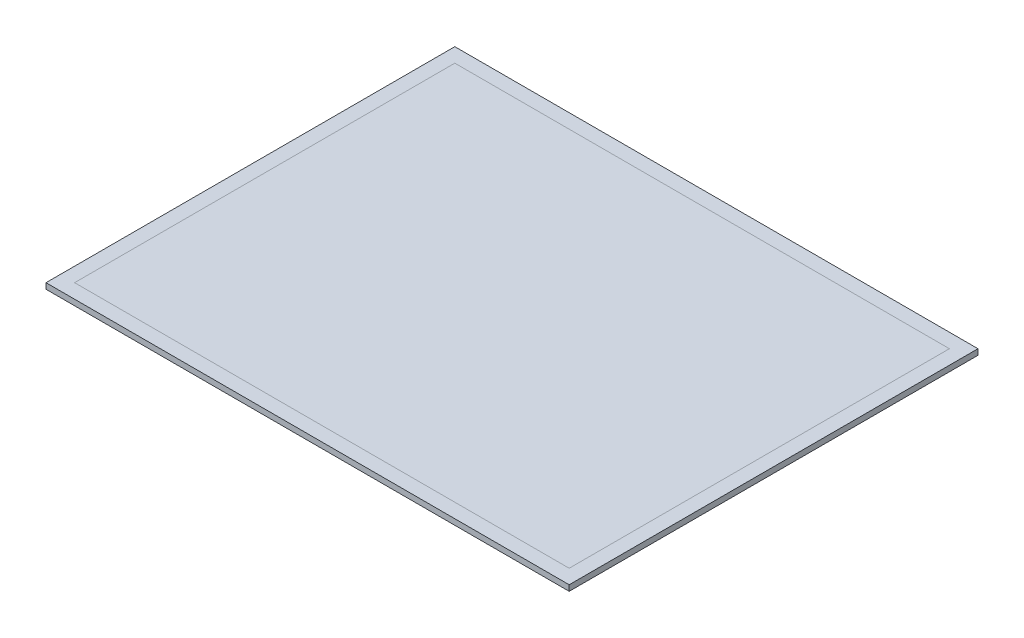
ISO-10303-21;
HEADER;
FILE_DESCRIPTION(('STEP AP214'),'2;1');
FILE_NAME('part.step','',(''),(''),'','','');
FILE_SCHEMA(('AUTOMOTIVE_DESIGN { 1 0 10303 214 1 1 1 1 }'));
ENDSEC;
DATA;
#1=APPLICATION_CONTEXT('core data for automotive mechanical design processes');
#2=APPLICATION_PROTOCOL_DEFINITION('international standard','automotive_design',2000,#1);
#3=PRODUCT_CONTEXT('',#1,'mechanical');
#4=PRODUCT('Part','Part','',(#3));
#5=PRODUCT_RELATED_PRODUCT_CATEGORY('part','',(#4));
#6=PRODUCT_DEFINITION_FORMATION('','',#4);
#7=PRODUCT_DEFINITION_CONTEXT('part definition',#1,'design');
#8=PRODUCT_DEFINITION('design','',#6,#7);
#9=PRODUCT_DEFINITION_SHAPE('','',#8);
#10=(LENGTH_UNIT() NAMED_UNIT(*) SI_UNIT(.MILLI.,.METRE.));
#11=(NAMED_UNIT(*) PLANE_ANGLE_UNIT() SI_UNIT($,.RADIAN.));
#12=(NAMED_UNIT(*) SI_UNIT($,.STERADIAN.) SOLID_ANGLE_UNIT());
#13=UNCERTAINTY_MEASURE_WITH_UNIT(LENGTH_MEASURE(1.E-05),#10,'distance_accuracy_value','');
#14=(GEOMETRIC_REPRESENTATION_CONTEXT(3) GLOBAL_UNCERTAINTY_ASSIGNED_CONTEXT((#13)) GLOBAL_UNIT_ASSIGNED_CONTEXT((#10,
#11,#12)) REPRESENTATION_CONTEXT('',''));
#15=CARTESIAN_POINT('',(0.,0.,0.));
#16=DIRECTION('',(0.,0.,1.));
#17=DIRECTION('',(1.,0.,0.));
#18=AXIS2_PLACEMENT_3D('',#15,#16,#17);
#19=CARTESIAN_POINT('',(-86.5,2.,0.));
#20=DIRECTION('',(-1.,0.,0.));
#21=DIRECTION('',(0.,0.,1.));
#22=AXIS2_PLACEMENT_3D('',#19,#20,#21);
#23=PLANE('',#22);
#24=DIRECTION('',(0.,0.,-1.));
#25=VECTOR('',#24,1.);
#26=CARTESIAN_POINT('',(-86.5,0.,0.));
#27=LINE('',#26,#25);
#28=CARTESIAN_POINT('',(-86.5,0.,66.5));
#29=VERTEX_POINT('',#28);
#30=CARTESIAN_POINT('',(-86.5,0.,-66.5));
#31=VERTEX_POINT('',#30);
#32=EDGE_CURVE('E110',#29,#31,#27,.T.);
#33=ORIENTED_EDGE('',*,*,#32,.F.);
#34=DIRECTION('',(0.,-1.,0.));
#35=VECTOR('',#34,1.);
#36=CARTESIAN_POINT('',(-86.5,2.,66.5));
#37=LINE('',#36,#35);
#38=CARTESIAN_POINT('',(-86.5,2.,66.5));
#39=VERTEX_POINT('',#38);
#40=EDGE_CURVE('E12',#39,#29,#37,.T.);
#41=ORIENTED_EDGE('',*,*,#40,.F.);
#42=DIRECTION('',(0.,0.,-1.));
#43=VECTOR('',#42,1.);
#44=CARTESIAN_POINT('',(-86.5,2.,0.));
#45=LINE('',#44,#43);
#46=CARTESIAN_POINT('',(-86.5,2.,-66.5));
#47=VERTEX_POINT('',#46);
#48=EDGE_CURVE('E95',#39,#47,#45,.T.);
#49=ORIENTED_EDGE('',*,*,#48,.T.);
#50=DIRECTION('',(0.,-1.,0.));
#51=VECTOR('',#50,1.);
#52=CARTESIAN_POINT('',(-86.5,2.,-66.5));
#53=LINE('',#52,#51);
#54=EDGE_CURVE('E63',#47,#31,#53,.T.);
#55=ORIENTED_EDGE('',*,*,#54,.T.);
#56=EDGE_LOOP('',(#33,#41,#49,#55));
#57=FACE_BOUND('',#56,.T.);
#58=ADVANCED_FACE('F47',(#57),#23,.T.);
#59=CARTESIAN_POINT('',(0.,2.,66.5));
#60=DIRECTION('',(0.,0.,-1.));
#61=DIRECTION('',(-1.,0.,0.));
#62=AXIS2_PLACEMENT_3D('',#59,#60,#61);
#63=PLANE('',#62);
#64=DIRECTION('',(1.,0.,0.));
#65=VECTOR('',#64,1.);
#66=CARTESIAN_POINT('',(0.,0.,66.5));
#67=LINE('',#66,#65);
#68=CARTESIAN_POINT('',(86.5,0.,66.5));
#69=VERTEX_POINT('',#68);
#70=EDGE_CURVE('E101',#29,#69,#67,.T.);
#71=ORIENTED_EDGE('',*,*,#70,.T.);
#72=DIRECTION('',(0.,-1.,0.));
#73=VECTOR('',#72,1.);
#74=CARTESIAN_POINT('',(86.5,2.,66.5));
#75=LINE('',#74,#73);
#76=CARTESIAN_POINT('',(86.5,2.,66.5));
#77=VERTEX_POINT('',#76);
#78=EDGE_CURVE('E55',#77,#69,#75,.T.);
#79=ORIENTED_EDGE('',*,*,#78,.F.);
#80=DIRECTION('',(1.,0.,0.));
#81=VECTOR('',#80,1.);
#82=CARTESIAN_POINT('',(0.,2.,66.5));
#83=LINE('',#82,#81);
#84=EDGE_CURVE('E89',#39,#77,#83,.T.);
#85=ORIENTED_EDGE('',*,*,#84,.F.);
#86=ORIENTED_EDGE('',*,*,#40,.T.);
#87=EDGE_LOOP('',(#71,#79,#85,#86));
#88=FACE_BOUND('',#87,.T.);
#89=ADVANCED_FACE('F99',(#88),#63,.F.);
#90=CARTESIAN_POINT('',(86.5,2.,0.));
#91=DIRECTION('',(-1.,0.,0.));
#92=DIRECTION('',(0.,0.,1.));
#93=AXIS2_PLACEMENT_3D('',#90,#91,#92);
#94=PLANE('',#93);
#95=DIRECTION('',(0.,0.,-1.));
#96=VECTOR('',#95,1.);
#97=CARTESIAN_POINT('',(86.5,0.,0.));
#98=LINE('',#97,#96);
#99=CARTESIAN_POINT('',(86.5,0.,-66.5));
#100=VERTEX_POINT('',#99);
#101=EDGE_CURVE('E113',#69,#100,#98,.T.);
#102=ORIENTED_EDGE('',*,*,#101,.T.);
#103=DIRECTION('',(0.,-1.,0.));
#104=VECTOR('',#103,1.);
#105=CARTESIAN_POINT('',(86.5,2.,-66.5));
#106=LINE('',#105,#104);
#107=CARTESIAN_POINT('',(86.5,2.,-66.5));
#108=VERTEX_POINT('',#107);
#109=EDGE_CURVE('E77',#108,#100,#106,.T.);
#110=ORIENTED_EDGE('',*,*,#109,.F.);
#111=DIRECTION('',(0.,0.,-1.));
#112=VECTOR('',#111,1.);
#113=CARTESIAN_POINT('',(86.5,2.,0.));
#114=LINE('',#113,#112);
#115=EDGE_CURVE('E94',#77,#108,#114,.T.);
#116=ORIENTED_EDGE('',*,*,#115,.F.);
#117=ORIENTED_EDGE('',*,*,#78,.T.);
#118=EDGE_LOOP('',(#102,#110,#116,#117));
#119=FACE_BOUND('',#118,.T.);
#120=ADVANCED_FACE('F104',(#119),#94,.F.);
#121=CARTESIAN_POINT('',(0.,2.,-66.5));
#122=DIRECTION('',(0.,0.,-1.));
#123=DIRECTION('',(-1.,0.,0.));
#124=AXIS2_PLACEMENT_3D('',#121,#122,#123);
#125=PLANE('',#124);
#126=DIRECTION('',(1.,0.,0.));
#127=VECTOR('',#126,1.);
#128=CARTESIAN_POINT('',(0.,0.,-66.5));
#129=LINE('',#128,#127);
#130=EDGE_CURVE('E115',#31,#100,#129,.T.);
#131=ORIENTED_EDGE('',*,*,#130,.F.);
#132=ORIENTED_EDGE('',*,*,#54,.F.);
#133=DIRECTION('',(1.,0.,0.));
#134=VECTOR('',#133,1.);
#135=CARTESIAN_POINT('',(0.,2.,-66.5));
#136=LINE('',#135,#134);
#137=EDGE_CURVE('E105',#47,#108,#136,.T.);
#138=ORIENTED_EDGE('',*,*,#137,.T.);
#139=ORIENTED_EDGE('',*,*,#109,.T.);
#140=EDGE_LOOP('',(#131,#132,#138,#139));
#141=FACE_BOUND('',#140,.T.);
#142=ADVANCED_FACE('F120',(#141),#125,.T.);
#143=CARTESIAN_POINT('',(0.,2.,0.));
#144=DIRECTION('',(0.,1.,0.));
#145=DIRECTION('',(0.,0.,1.));
#146=AXIS2_PLACEMENT_3D('',#143,#144,#145);
#147=PLANE('',#146);
#148=ORIENTED_EDGE('',*,*,#48,.F.);
#149=ORIENTED_EDGE('',*,*,#84,.T.);
#150=ORIENTED_EDGE('',*,*,#115,.T.);
#151=ORIENTED_EDGE('',*,*,#137,.F.);
#152=EDGE_LOOP('',(#148,#149,#150,#151));
#153=FACE_BOUND('',#152,.T.);
#154=ADVANCED_FACE('F91',(#153),#147,.T.);
#155=CARTESIAN_POINT('',(0.,0.,0.));
#156=DIRECTION('',(0.,1.,0.));
#157=DIRECTION('',(0.,0.,1.));
#158=AXIS2_PLACEMENT_3D('',#155,#156,#157);
#159=PLANE('',#158);
#160=ORIENTED_EDGE('',*,*,#32,.T.);
#161=ORIENTED_EDGE('',*,*,#130,.T.);
#162=ORIENTED_EDGE('',*,*,#101,.F.);
#163=ORIENTED_EDGE('',*,*,#70,.F.);
#164=EDGE_LOOP('',(#160,#161,#162,#163));
#165=FACE_BOUND('',#164,.T.);
#166=ADVANCED_FACE('F127',(#165),#159,.F.);
#167=CLOSED_SHELL('',(#58,#89,#120,#142,#154,#166));
#168=MANIFOLD_SOLID_BREP('B2',#167);
#169=CARTESIAN_POINT('',(0.,2.,0.));
#170=DIRECTION('',(0.,-1.,0.));
#171=DIRECTION('',(0.,0.,-1.));
#172=AXIS2_PLACEMENT_3D('',#169,#170,#171);
#173=PLANE('',#172);
#174=DIRECTION('',(0.,0.,-1.));
#175=VECTOR('',#174,1.);
#176=CARTESIAN_POINT('',(91.5,2.,71.5));
#177=LINE('',#176,#175);
#178=CARTESIAN_POINT('',(91.5,2.,71.5));
#179=VERTEX_POINT('',#178);
#180=CARTESIAN_POINT('',(91.5,2.,-71.5));
#181=VERTEX_POINT('',#180);
#182=EDGE_CURVE('E284',#179,#181,#177,.T.);
#183=ORIENTED_EDGE('',*,*,#182,.T.);
#184=DIRECTION('',(-1.,0.,0.));
#185=VECTOR('',#184,1.);
#186=CARTESIAN_POINT('',(-91.5,2.,-71.5));
#187=LINE('',#186,#185);
#188=CARTESIAN_POINT('',(-91.5,2.,-71.5));
#189=VERTEX_POINT('',#188);
#190=EDGE_CURVE('E287',#181,#189,#187,.T.);
#191=ORIENTED_EDGE('',*,*,#190,.T.);
#192=DIRECTION('',(0.,0.,1.));
#193=VECTOR('',#192,1.);
#194=CARTESIAN_POINT('',(-91.5,2.,71.5));
#195=LINE('',#194,#193);
#196=CARTESIAN_POINT('',(-91.5,2.,71.5));
#197=VERTEX_POINT('',#196);
#198=EDGE_CURVE('E290',#189,#197,#195,.T.);
#199=ORIENTED_EDGE('',*,*,#198,.T.);
#200=DIRECTION('',(1.,0.,0.));
#201=VECTOR('',#200,1.);
#202=CARTESIAN_POINT('',(-91.5,2.,71.5));
#203=LINE('',#202,#201);
#204=EDGE_CURVE('E292',#197,#179,#203,.T.);
#205=ORIENTED_EDGE('',*,*,#204,.T.);
#206=EDGE_LOOP('',(#183,#191,#199,#205));
#207=FACE_BOUND('',#206,.T.);
#208=DIRECTION('',(1.,0.,0.));
#209=VECTOR('',#208,1.);
#210=CARTESIAN_POINT('',(-86.5,2.,66.5));
#211=LINE('',#210,#209);
#212=CARTESIAN_POINT('',(-86.5,2.,66.5));
#213=VERTEX_POINT('',#212);
#214=CARTESIAN_POINT('',(86.5,2.,66.5));
#215=VERTEX_POINT('',#214);
#216=EDGE_CURVE('E248',#213,#215,#211,.T.);
#217=ORIENTED_EDGE('',*,*,#216,.F.);
#218=DIRECTION('',(0.,0.,1.));
#219=VECTOR('',#218,1.);
#220=CARTESIAN_POINT('',(-86.5,2.,66.5));
#221=LINE('',#220,#219);
#222=CARTESIAN_POINT('',(-86.5,2.,-66.5));
#223=VERTEX_POINT('',#222);
#224=EDGE_CURVE('E270',#223,#213,#221,.T.);
#225=ORIENTED_EDGE('',*,*,#224,.F.);
#226=DIRECTION('',(-1.,0.,0.));
#227=VECTOR('',#226,1.);
#228=CARTESIAN_POINT('',(-86.5,2.,-66.5));
#229=LINE('',#228,#227);
#230=CARTESIAN_POINT('',(86.5,2.,-66.5));
#231=VERTEX_POINT('',#230);
#232=EDGE_CURVE('E268',#231,#223,#229,.T.);
#233=ORIENTED_EDGE('',*,*,#232,.F.);
#234=DIRECTION('',(0.,0.,-1.));
#235=VECTOR('',#234,1.);
#236=CARTESIAN_POINT('',(86.5,2.,66.5));
#237=LINE('',#236,#235);
#238=EDGE_CURVE('E256',#215,#231,#237,.T.);
#239=ORIENTED_EDGE('',*,*,#238,.F.);
#240=EDGE_LOOP('',(#217,#225,#233,#239));
#241=FACE_BOUND('',#240,.T.);
#242=ADVANCED_FACE('F183',(#207,#241),#173,.F.);
#243=CARTESIAN_POINT('',(0.,0.,0.));
#244=DIRECTION('',(0.,-1.,0.));
#245=DIRECTION('',(0.,0.,-1.));
#246=AXIS2_PLACEMENT_3D('',#243,#244,#245);
#247=PLANE('',#246);
#248=DIRECTION('',(0.,0.,-1.));
#249=VECTOR('',#248,1.);
#250=CARTESIAN_POINT('',(91.5,0.,71.5));
#251=LINE('',#250,#249);
#252=CARTESIAN_POINT('',(91.5,0.,71.5));
#253=VERTEX_POINT('',#252);
#254=CARTESIAN_POINT('',(91.5,0.,-71.5));
#255=VERTEX_POINT('',#254);
#256=EDGE_CURVE('E264',#253,#255,#251,.T.);
#257=ORIENTED_EDGE('',*,*,#256,.F.);
#258=DIRECTION('',(1.,0.,0.));
#259=VECTOR('',#258,1.);
#260=CARTESIAN_POINT('',(-91.5,0.,71.5));
#261=LINE('',#260,#259);
#262=CARTESIAN_POINT('',(-91.5,0.,71.5));
#263=VERTEX_POINT('',#262);
#264=EDGE_CURVE('E288',#263,#253,#261,.T.);
#265=ORIENTED_EDGE('',*,*,#264,.F.);
#266=DIRECTION('',(0.,0.,1.));
#267=VECTOR('',#266,1.);
#268=CARTESIAN_POINT('',(-91.5,0.,71.5));
#269=LINE('',#268,#267);
#270=CARTESIAN_POINT('',(-91.5,0.,-71.5));
#271=VERTEX_POINT('',#270);
#272=EDGE_CURVE('E299',#271,#263,#269,.T.);
#273=ORIENTED_EDGE('',*,*,#272,.F.);
#274=DIRECTION('',(-1.,0.,0.));
#275=VECTOR('',#274,1.);
#276=CARTESIAN_POINT('',(-91.5,0.,-71.5));
#277=LINE('',#276,#275);
#278=EDGE_CURVE('E297',#255,#271,#277,.T.);
#279=ORIENTED_EDGE('',*,*,#278,.F.);
#280=EDGE_LOOP('',(#257,#265,#273,#279));
#281=FACE_BOUND('',#280,.T.);
#282=DIRECTION('',(0.,0.,1.));
#283=VECTOR('',#282,1.);
#284=CARTESIAN_POINT('',(-86.5,0.,66.5));
#285=LINE('',#284,#283);
#286=CARTESIAN_POINT('',(-86.5,0.,-66.5));
#287=VERTEX_POINT('',#286);
#288=CARTESIAN_POINT('',(-86.5,0.,66.5));
#289=VERTEX_POINT('',#288);
#290=EDGE_CURVE('E257',#287,#289,#285,.T.);
#291=ORIENTED_EDGE('',*,*,#290,.T.);
#292=DIRECTION('',(1.,0.,0.));
#293=VECTOR('',#292,1.);
#294=CARTESIAN_POINT('',(-86.5,0.,66.5));
#295=LINE('',#294,#293);
#296=CARTESIAN_POINT('',(86.5,0.,66.5));
#297=VERTEX_POINT('',#296);
#298=EDGE_CURVE('E206',#289,#297,#295,.T.);
#299=ORIENTED_EDGE('',*,*,#298,.T.);
#300=DIRECTION('',(0.,0.,-1.));
#301=VECTOR('',#300,1.);
#302=CARTESIAN_POINT('',(86.5,0.,66.5));
#303=LINE('',#302,#301);
#304=CARTESIAN_POINT('',(86.5,0.,-66.5));
#305=VERTEX_POINT('',#304);
#306=EDGE_CURVE('E263',#297,#305,#303,.T.);
#307=ORIENTED_EDGE('',*,*,#306,.T.);
#308=DIRECTION('',(-1.,0.,0.));
#309=VECTOR('',#308,1.);
#310=CARTESIAN_POINT('',(-86.5,0.,-66.5));
#311=LINE('',#310,#309);
#312=EDGE_CURVE('E276',#305,#287,#311,.T.);
#313=ORIENTED_EDGE('',*,*,#312,.T.);
#314=EDGE_LOOP('',(#291,#299,#307,#313));
#315=FACE_BOUND('',#314,.T.);
#316=ADVANCED_FACE('F317',(#281,#315),#247,.T.);
#317=CARTESIAN_POINT('',(91.5,2.,71.5));
#318=DIRECTION('',(-1.,0.,0.));
#319=DIRECTION('',(0.,0.,1.));
#320=AXIS2_PLACEMENT_3D('',#317,#318,#319);
#321=PLANE('',#320);
#322=ORIENTED_EDGE('',*,*,#256,.T.);
#323=DIRECTION('',(0.,-1.,0.));
#324=VECTOR('',#323,1.);
#325=CARTESIAN_POINT('',(91.5,2.,-71.5));
#326=LINE('',#325,#324);
#327=EDGE_CURVE('E45',#181,#255,#326,.T.);
#328=ORIENTED_EDGE('',*,*,#327,.F.);
#329=ORIENTED_EDGE('',*,*,#182,.F.);
#330=DIRECTION('',(0.,-1.,0.));
#331=VECTOR('',#330,1.);
#332=CARTESIAN_POINT('',(91.5,2.,71.5));
#333=LINE('',#332,#331);
#334=EDGE_CURVE('E294',#179,#253,#333,.T.);
#335=ORIENTED_EDGE('',*,*,#334,.T.);
#336=EDGE_LOOP('',(#322,#328,#329,#335));
#337=FACE_BOUND('',#336,.T.);
#338=ADVANCED_FACE('F185',(#337),#321,.F.);
#339=CARTESIAN_POINT('',(-91.5,2.,-71.5));
#340=DIRECTION('',(0.,0.,1.));
#341=DIRECTION('',(1.,0.,0.));
#342=AXIS2_PLACEMENT_3D('',#339,#340,#341);
#343=PLANE('',#342);
#344=ORIENTED_EDGE('',*,*,#278,.T.);
#345=DIRECTION('',(0.,-1.,0.));
#346=VECTOR('',#345,1.);
#347=CARTESIAN_POINT('',(-91.5,2.,-71.5));
#348=LINE('',#347,#346);
#349=EDGE_CURVE('E191',#189,#271,#348,.T.);
#350=ORIENTED_EDGE('',*,*,#349,.F.);
#351=ORIENTED_EDGE('',*,*,#190,.F.);
#352=ORIENTED_EDGE('',*,*,#327,.T.);
#353=EDGE_LOOP('',(#344,#350,#351,#352));
#354=FACE_BOUND('',#353,.T.);
#355=ADVANCED_FACE('F327',(#354),#343,.F.);
#356=CARTESIAN_POINT('',(-91.5,2.,71.5));
#357=DIRECTION('',(1.,0.,0.));
#358=DIRECTION('',(0.,0.,-1.));
#359=AXIS2_PLACEMENT_3D('',#356,#357,#358);
#360=PLANE('',#359);
#361=ORIENTED_EDGE('',*,*,#272,.T.);
#362=DIRECTION('',(0.,-1.,0.));
#363=VECTOR('',#362,1.);
#364=CARTESIAN_POINT('',(-91.5,2.,71.5));
#365=LINE('',#364,#363);
#366=EDGE_CURVE('E304',#197,#263,#365,.T.);
#367=ORIENTED_EDGE('',*,*,#366,.F.);
#368=ORIENTED_EDGE('',*,*,#198,.F.);
#369=ORIENTED_EDGE('',*,*,#349,.T.);
#370=EDGE_LOOP('',(#361,#367,#368,#369));
#371=FACE_BOUND('',#370,.T.);
#372=ADVANCED_FACE('F311',(#371),#360,.F.);
#373=CARTESIAN_POINT('',(-91.5,2.,71.5));
#374=DIRECTION('',(0.,0.,-1.));
#375=DIRECTION('',(-1.,0.,0.));
#376=AXIS2_PLACEMENT_3D('',#373,#374,#375);
#377=PLANE('',#376);
#378=ORIENTED_EDGE('',*,*,#264,.T.);
#379=ORIENTED_EDGE('',*,*,#334,.F.);
#380=ORIENTED_EDGE('',*,*,#204,.F.);
#381=ORIENTED_EDGE('',*,*,#366,.T.);
#382=EDGE_LOOP('',(#378,#379,#380,#381));
#383=FACE_BOUND('',#382,.T.);
#384=ADVANCED_FACE('F321',(#383),#377,.F.);
#385=CARTESIAN_POINT('',(-86.5,2.,66.5));
#386=DIRECTION('',(0.,0.,-1.));
#387=DIRECTION('',(-1.,0.,0.));
#388=AXIS2_PLACEMENT_3D('',#385,#386,#387);
#389=PLANE('',#388);
#390=ORIENTED_EDGE('',*,*,#298,.F.);
#391=DIRECTION('',(0.,-1.,0.));
#392=VECTOR('',#391,1.);
#393=CARTESIAN_POINT('',(-86.5,2.,66.5));
#394=LINE('',#393,#392);
#395=EDGE_CURVE('E252',#213,#289,#394,.T.);
#396=ORIENTED_EDGE('',*,*,#395,.F.);
#397=ORIENTED_EDGE('',*,*,#216,.T.);
#398=DIRECTION('',(0.,-1.,0.));
#399=VECTOR('',#398,1.);
#400=CARTESIAN_POINT('',(86.5,2.,66.5));
#401=LINE('',#400,#399);
#402=EDGE_CURVE('E251',#215,#297,#401,.T.);
#403=ORIENTED_EDGE('',*,*,#402,.T.);
#404=EDGE_LOOP('',(#390,#396,#397,#403));
#405=FACE_BOUND('',#404,.T.);
#406=ADVANCED_FACE('F250',(#405),#389,.T.);
#407=CARTESIAN_POINT('',(86.5,2.,66.5));
#408=DIRECTION('',(-1.,0.,0.));
#409=DIRECTION('',(0.,0.,1.));
#410=AXIS2_PLACEMENT_3D('',#407,#408,#409);
#411=PLANE('',#410);
#412=ORIENTED_EDGE('',*,*,#306,.F.);
#413=ORIENTED_EDGE('',*,*,#402,.F.);
#414=ORIENTED_EDGE('',*,*,#238,.T.);
#415=DIRECTION('',(0.,-1.,0.));
#416=VECTOR('',#415,1.);
#417=CARTESIAN_POINT('',(86.5,2.,-66.5));
#418=LINE('',#417,#416);
#419=EDGE_CURVE('E265',#231,#305,#418,.T.);
#420=ORIENTED_EDGE('',*,*,#419,.T.);
#421=EDGE_LOOP('',(#412,#413,#414,#420));
#422=FACE_BOUND('',#421,.T.);
#423=ADVANCED_FACE('F260',(#422),#411,.T.);
#424=CARTESIAN_POINT('',(-86.5,2.,-66.5));
#425=DIRECTION('',(0.,0.,1.));
#426=DIRECTION('',(1.,0.,0.));
#427=AXIS2_PLACEMENT_3D('',#424,#425,#426);
#428=PLANE('',#427);
#429=ORIENTED_EDGE('',*,*,#312,.F.);
#430=ORIENTED_EDGE('',*,*,#419,.F.);
#431=ORIENTED_EDGE('',*,*,#232,.T.);
#432=DIRECTION('',(0.,-1.,0.));
#433=VECTOR('',#432,1.);
#434=CARTESIAN_POINT('',(-86.5,2.,-66.5));
#435=LINE('',#434,#433);
#436=EDGE_CURVE('E198',#223,#287,#435,.T.);
#437=ORIENTED_EDGE('',*,*,#436,.T.);
#438=EDGE_LOOP('',(#429,#430,#431,#437));
#439=FACE_BOUND('',#438,.T.);
#440=ADVANCED_FACE('F350',(#439),#428,.T.);
#441=CARTESIAN_POINT('',(-86.5,2.,66.5));
#442=DIRECTION('',(1.,0.,0.));
#443=DIRECTION('',(0.,0.,-1.));
#444=AXIS2_PLACEMENT_3D('',#441,#442,#443);
#445=PLANE('',#444);
#446=ORIENTED_EDGE('',*,*,#290,.F.);
#447=ORIENTED_EDGE('',*,*,#436,.F.);
#448=ORIENTED_EDGE('',*,*,#224,.T.);
#449=ORIENTED_EDGE('',*,*,#395,.T.);
#450=EDGE_LOOP('',(#446,#447,#448,#449));
#451=FACE_BOUND('',#450,.T.);
#452=ADVANCED_FACE('F354',(#451),#445,.T.);
#453=CLOSED_SHELL('',(#242,#316,#338,#355,#372,#384,#406,#423,#440,#452));
#454=MANIFOLD_SOLID_BREP('B6',#453);
#455=ADVANCED_BREP_SHAPE_REPRESENTATION('',(#18,#168,#454),#14);
#456=SHAPE_DEFINITION_REPRESENTATION(#9,#455);
ENDSEC;
END-ISO-10303-21;
